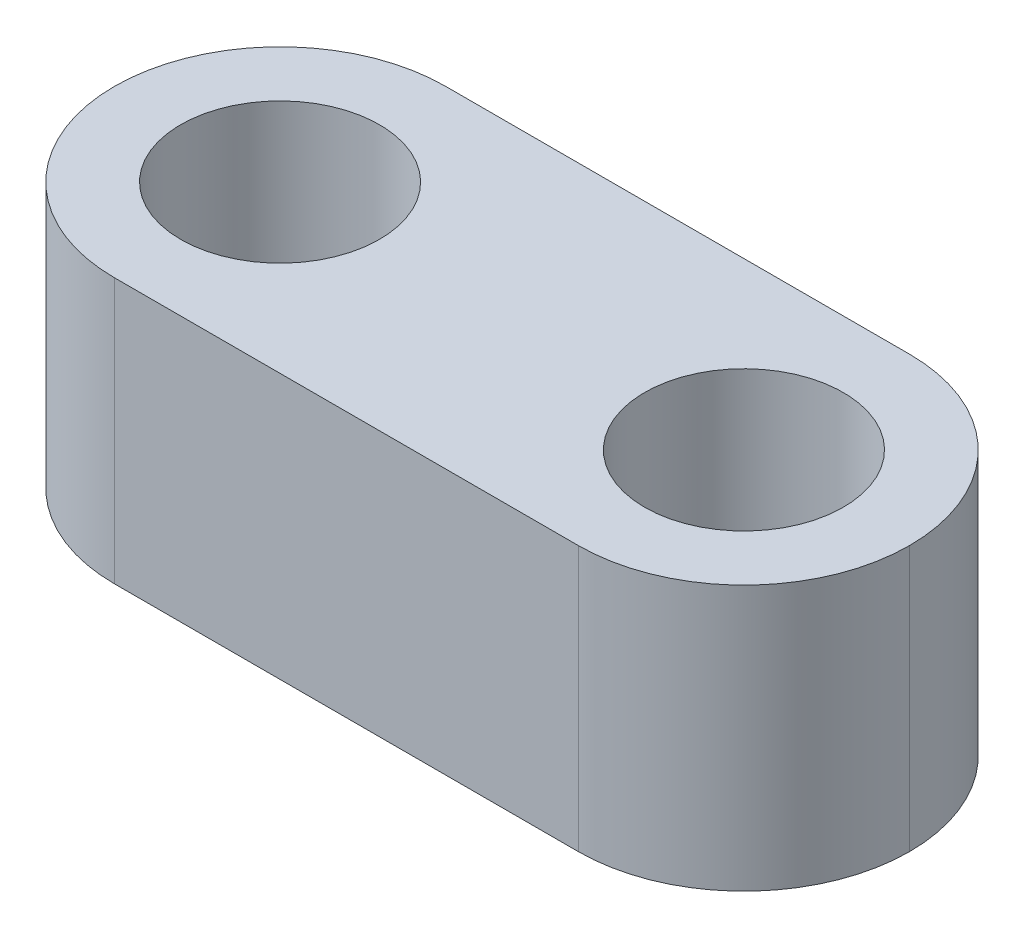
ISO-10303-21;
HEADER;
FILE_DESCRIPTION(('STEP AP214'),'2;1');
FILE_NAME('part.step','',(''),(''),'','','');
FILE_SCHEMA(('AUTOMOTIVE_DESIGN { 1 0 10303 214 1 1 1 1 }'));
ENDSEC;
DATA;
#1=APPLICATION_CONTEXT('core data for automotive mechanical design processes');
#2=APPLICATION_PROTOCOL_DEFINITION('international standard','automotive_design',2000,#1);
#3=PRODUCT_CONTEXT('',#1,'mechanical');
#4=PRODUCT('Part','Part','',(#3));
#5=PRODUCT_RELATED_PRODUCT_CATEGORY('part','',(#4));
#6=PRODUCT_DEFINITION_FORMATION('','',#4);
#7=PRODUCT_DEFINITION_CONTEXT('part definition',#1,'design');
#8=PRODUCT_DEFINITION('design','',#6,#7);
#9=PRODUCT_DEFINITION_SHAPE('','',#8);
#10=(LENGTH_UNIT() NAMED_UNIT(*) SI_UNIT(.MILLI.,.METRE.));
#11=(NAMED_UNIT(*) PLANE_ANGLE_UNIT() SI_UNIT($,.RADIAN.));
#12=(NAMED_UNIT(*) SI_UNIT($,.STERADIAN.) SOLID_ANGLE_UNIT());
#13=UNCERTAINTY_MEASURE_WITH_UNIT(LENGTH_MEASURE(1.E-05),#10,'distance_accuracy_value','');
#14=(GEOMETRIC_REPRESENTATION_CONTEXT(3) GLOBAL_UNCERTAINTY_ASSIGNED_CONTEXT((#13)) GLOBAL_UNIT_ASSIGNED_CONTEXT((#10,
#11,#12)) REPRESENTATION_CONTEXT('',''));
#15=CARTESIAN_POINT('',(0.,0.,0.));
#16=DIRECTION('',(0.,0.,1.));
#17=DIRECTION('',(1.,0.,0.));
#18=AXIS2_PLACEMENT_3D('',#15,#16,#17);
#19=CARTESIAN_POINT('',(-6.,4.,-2.5));
#20=DIRECTION('',(0.,0.,1.));
#21=DIRECTION('',(1.,0.,0.));
#22=AXIS2_PLACEMENT_3D('',#19,#20,#21);
#23=PLANE('',#22);
#24=DIRECTION('',(-1.,0.,0.));
#25=VECTOR('',#24,1.);
#26=CARTESIAN_POINT('',(-6.,4.,-2.5));
#27=LINE('',#26,#25);
#28=CARTESIAN_POINT('',(3.5,4.,-2.5));
#29=VERTEX_POINT('',#28);
#30=CARTESIAN_POINT('',(-3.5,4.,-2.5));
#31=VERTEX_POINT('',#30);
#32=EDGE_CURVE('E132',#29,#31,#27,.T.);
#33=ORIENTED_EDGE('',*,*,#32,.F.);
#34=DIRECTION('',(0.,-1.,0.));
#35=VECTOR('',#34,1.);
#36=CARTESIAN_POINT('',(3.5,4.,-2.5));
#37=LINE('',#36,#35);
#38=CARTESIAN_POINT('',(3.5,0.,-2.5));
#39=VERTEX_POINT('',#38);
#40=EDGE_CURVE('E11',#29,#39,#37,.T.);
#41=ORIENTED_EDGE('',*,*,#40,.T.);
#42=DIRECTION('',(-1.,0.,0.));
#43=VECTOR('',#42,1.);
#44=CARTESIAN_POINT('',(-6.,0.,-2.5));
#45=LINE('',#44,#43);
#46=CARTESIAN_POINT('',(-3.5,0.,-2.5));
#47=VERTEX_POINT('',#46);
#48=EDGE_CURVE('E95',#39,#47,#45,.T.);
#49=ORIENTED_EDGE('',*,*,#48,.T.);
#50=DIRECTION('',(0.,-1.,0.));
#51=VECTOR('',#50,1.);
#52=CARTESIAN_POINT('',(-3.5,4.,-2.5));
#53=LINE('',#52,#51);
#54=EDGE_CURVE('E42',#47,#31,#53,.F.);
#55=ORIENTED_EDGE('',*,*,#54,.T.);
#56=EDGE_LOOP('',(#33,#41,#49,#55));
#57=FACE_BOUND('',#56,.T.);
#58=ADVANCED_FACE('F33',(#57),#23,.F.);
#59=CARTESIAN_POINT('',(-6.,4.,2.5));
#60=DIRECTION('',(0.,0.,-1.));
#61=DIRECTION('',(-1.,0.,0.));
#62=AXIS2_PLACEMENT_3D('',#59,#60,#61);
#63=PLANE('',#62);
#64=DIRECTION('',(1.,0.,0.));
#65=VECTOR('',#64,1.);
#66=CARTESIAN_POINT('',(-6.,0.,2.5));
#67=LINE('',#66,#65);
#68=CARTESIAN_POINT('',(-3.5,0.,2.5));
#69=VERTEX_POINT('',#68);
#70=CARTESIAN_POINT('',(3.5,0.,2.5));
#71=VERTEX_POINT('',#70);
#72=EDGE_CURVE('E131',#69,#71,#67,.T.);
#73=ORIENTED_EDGE('',*,*,#72,.T.);
#74=DIRECTION('',(0.,-1.,0.));
#75=VECTOR('',#74,1.);
#76=CARTESIAN_POINT('',(3.5,4.,2.5));
#77=LINE('',#76,#75);
#78=CARTESIAN_POINT('',(3.5,4.,2.5));
#79=VERTEX_POINT('',#78);
#80=EDGE_CURVE('E110',#71,#79,#77,.F.);
#81=ORIENTED_EDGE('',*,*,#80,.T.);
#82=DIRECTION('',(1.,0.,0.));
#83=VECTOR('',#82,1.);
#84=CARTESIAN_POINT('',(-6.,4.,2.5));
#85=LINE('',#84,#83);
#86=CARTESIAN_POINT('',(-3.5,4.,2.5));
#87=VERTEX_POINT('',#86);
#88=EDGE_CURVE('E127',#87,#79,#85,.T.);
#89=ORIENTED_EDGE('',*,*,#88,.F.);
#90=DIRECTION('',(0.,-1.,0.));
#91=VECTOR('',#90,1.);
#92=CARTESIAN_POINT('',(-3.5,4.,2.5));
#93=LINE('',#92,#91);
#94=EDGE_CURVE('E111',#87,#69,#93,.T.);
#95=ORIENTED_EDGE('',*,*,#94,.T.);
#96=EDGE_LOOP('',(#73,#81,#89,#95));
#97=FACE_BOUND('',#96,.T.);
#98=ADVANCED_FACE('F129',(#97),#63,.F.);
#99=CARTESIAN_POINT('',(0.,4.,0.));
#100=DIRECTION('',(0.,1.,0.));
#101=DIRECTION('',(0.,0.,1.));
#102=AXIS2_PLACEMENT_3D('',#99,#100,#101);
#103=PLANE('',#102);
#104=CARTESIAN_POINT('',(-3.5,4.,0.));
#105=DIRECTION('',(0.,1.,0.));
#106=DIRECTION('',(0.,0.,1.));
#107=AXIS2_PLACEMENT_3D('',#104,#105,#106);
#108=CIRCLE('',#107,1.5);
#109=CARTESIAN_POINT('',(-3.5,4.,1.5));
#110=VERTEX_POINT('',#109);
#111=EDGE_CURVE('E106',#110,#110,#108,.T.);
#112=ORIENTED_EDGE('',*,*,#111,.F.);
#113=EDGE_LOOP('',(#112));
#114=FACE_BOUND('',#113,.T.);
#115=CARTESIAN_POINT('',(3.5,4.,0.));
#116=DIRECTION('',(0.,1.,0.));
#117=DIRECTION('',(0.,0.,1.));
#118=AXIS2_PLACEMENT_3D('',#115,#116,#117);
#119=CIRCLE('',#118,1.5);
#120=CARTESIAN_POINT('',(3.5,4.,1.5));
#121=VERTEX_POINT('',#120);
#122=EDGE_CURVE('E187',#121,#121,#119,.T.);
#123=ORIENTED_EDGE('',*,*,#122,.F.);
#124=EDGE_LOOP('',(#123));
#125=FACE_BOUND('',#124,.T.);
#126=ORIENTED_EDGE('',*,*,#88,.T.);
#127=CARTESIAN_POINT('',(3.5,4.,0.));
#128=DIRECTION('',(0.,1.,0.));
#129=DIRECTION('',(0.,0.,1.));
#130=AXIS2_PLACEMENT_3D('',#127,#128,#129);
#131=CIRCLE('',#130,2.5);
#132=CARTESIAN_POINT('',(6.,4.,0.));
#133=VERTEX_POINT('',#132);
#134=EDGE_CURVE('E122',#79,#133,#131,.T.);
#135=ORIENTED_EDGE('',*,*,#134,.T.);
#136=CARTESIAN_POINT('',(3.5,4.,0.));
#137=DIRECTION('',(0.,1.,0.));
#138=DIRECTION('',(0.,0.,1.));
#139=AXIS2_PLACEMENT_3D('',#136,#137,#138);
#140=CIRCLE('',#139,2.5);
#141=EDGE_CURVE('E104',#133,#29,#140,.T.);
#142=ORIENTED_EDGE('',*,*,#141,.T.);
#143=ORIENTED_EDGE('',*,*,#32,.T.);
#144=CARTESIAN_POINT('',(-3.5,4.,0.));
#145=DIRECTION('',(0.,1.,0.));
#146=DIRECTION('',(0.,0.,1.));
#147=AXIS2_PLACEMENT_3D('',#144,#145,#146);
#148=CIRCLE('',#147,2.5);
#149=CARTESIAN_POINT('',(-6.,4.,0.));
#150=VERTEX_POINT('',#149);
#151=EDGE_CURVE('E50',#31,#150,#148,.T.);
#152=ORIENTED_EDGE('',*,*,#151,.T.);
#153=CARTESIAN_POINT('',(-3.5,4.,0.));
#154=DIRECTION('',(0.,1.,0.));
#155=DIRECTION('',(0.,0.,1.));
#156=AXIS2_PLACEMENT_3D('',#153,#154,#155);
#157=CIRCLE('',#156,2.5);
#158=EDGE_CURVE('E119',#150,#87,#157,.T.);
#159=ORIENTED_EDGE('',*,*,#158,.T.);
#160=EDGE_LOOP('',(#126,#135,#142,#143,#152,#159));
#161=FACE_BOUND('',#160,.T.);
#162=ADVANCED_FACE('F125',(#114,#125,#161),#103,.T.);
#163=CARTESIAN_POINT('',(0.,0.,0.));
#164=DIRECTION('',(0.,1.,0.));
#165=DIRECTION('',(0.,0.,1.));
#166=AXIS2_PLACEMENT_3D('',#163,#164,#165);
#167=PLANE('',#166);
#168=CARTESIAN_POINT('',(-3.5,0.,0.));
#169=DIRECTION('',(0.,1.,0.));
#170=DIRECTION('',(0.,0.,1.));
#171=AXIS2_PLACEMENT_3D('',#168,#169,#170);
#172=CIRCLE('',#171,1.5);
#173=CARTESIAN_POINT('',(-3.5,0.,1.5));
#174=VERTEX_POINT('',#173);
#175=EDGE_CURVE('E184',#174,#174,#172,.T.);
#176=ORIENTED_EDGE('',*,*,#175,.T.);
#177=EDGE_LOOP('',(#176));
#178=FACE_BOUND('',#177,.T.);
#179=CARTESIAN_POINT('',(3.5,0.,0.));
#180=DIRECTION('',(0.,1.,0.));
#181=DIRECTION('',(0.,0.,1.));
#182=AXIS2_PLACEMENT_3D('',#179,#180,#181);
#183=CIRCLE('',#182,1.5);
#184=CARTESIAN_POINT('',(3.5,0.,1.5));
#185=VERTEX_POINT('',#184);
#186=EDGE_CURVE('E135',#185,#185,#183,.T.);
#187=ORIENTED_EDGE('',*,*,#186,.T.);
#188=EDGE_LOOP('',(#187));
#189=FACE_BOUND('',#188,.T.);
#190=CARTESIAN_POINT('',(3.5,0.,0.));
#191=DIRECTION('',(0.,1.,0.));
#192=DIRECTION('',(0.,0.,1.));
#193=AXIS2_PLACEMENT_3D('',#190,#191,#192);
#194=CIRCLE('',#193,2.5);
#195=CARTESIAN_POINT('',(6.,0.,0.));
#196=VERTEX_POINT('',#195);
#197=EDGE_CURVE('E88',#39,#196,#194,.F.);
#198=ORIENTED_EDGE('',*,*,#197,.T.);
#199=CARTESIAN_POINT('',(3.5,0.,0.));
#200=DIRECTION('',(0.,1.,0.));
#201=DIRECTION('',(0.,0.,1.));
#202=AXIS2_PLACEMENT_3D('',#199,#200,#201);
#203=CIRCLE('',#202,2.5);
#204=EDGE_CURVE('E93',#196,#71,#203,.F.);
#205=ORIENTED_EDGE('',*,*,#204,.T.);
#206=ORIENTED_EDGE('',*,*,#72,.F.);
#207=CARTESIAN_POINT('',(-3.5,0.,0.));
#208=DIRECTION('',(0.,1.,0.));
#209=DIRECTION('',(0.,0.,1.));
#210=AXIS2_PLACEMENT_3D('',#207,#208,#209);
#211=CIRCLE('',#210,2.5);
#212=CARTESIAN_POINT('',(-6.,0.,0.));
#213=VERTEX_POINT('',#212);
#214=EDGE_CURVE('E98',#69,#213,#211,.F.);
#215=ORIENTED_EDGE('',*,*,#214,.T.);
#216=CARTESIAN_POINT('',(-3.5,0.,0.));
#217=DIRECTION('',(0.,1.,0.));
#218=DIRECTION('',(0.,0.,1.));
#219=AXIS2_PLACEMENT_3D('',#216,#217,#218);
#220=CIRCLE('',#219,2.5);
#221=EDGE_CURVE('E139',#213,#47,#220,.F.);
#222=ORIENTED_EDGE('',*,*,#221,.T.);
#223=ORIENTED_EDGE('',*,*,#48,.F.);
#224=EDGE_LOOP('',(#198,#205,#206,#215,#222,#223));
#225=FACE_BOUND('',#224,.T.);
#226=ADVANCED_FACE('F90',(#178,#189,#225),#167,.F.);
#227=CARTESIAN_POINT('',(3.5,0.,0.));
#228=DIRECTION('',(0.,1.,0.));
#229=DIRECTION('',(0.,0.,1.));
#230=AXIS2_PLACEMENT_3D('',#227,#228,#229);
#231=CYLINDRICAL_SURFACE('',#230,1.5);
#232=ORIENTED_EDGE('',*,*,#186,.F.);
#233=EDGE_LOOP('',(#232));
#234=FACE_BOUND('',#233,.T.);
#235=ORIENTED_EDGE('',*,*,#122,.T.);
#236=EDGE_LOOP('',(#235));
#237=FACE_BOUND('',#236,.T.);
#238=ADVANCED_FACE('F165',(#234,#237),#231,.F.);
#239=CARTESIAN_POINT('',(-3.5,0.,0.));
#240=DIRECTION('',(0.,1.,0.));
#241=DIRECTION('',(0.,0.,1.));
#242=AXIS2_PLACEMENT_3D('',#239,#240,#241);
#243=CYLINDRICAL_SURFACE('',#242,1.5);
#244=ORIENTED_EDGE('',*,*,#175,.F.);
#245=EDGE_LOOP('',(#244));
#246=FACE_BOUND('',#245,.T.);
#247=ORIENTED_EDGE('',*,*,#111,.T.);
#248=EDGE_LOOP('',(#247));
#249=FACE_BOUND('',#248,.T.);
#250=ADVANCED_FACE('F161',(#246,#249),#243,.F.);
#251=CARTESIAN_POINT('',(3.5,4.,0.));
#252=DIRECTION('',(0.,-1.,0.));
#253=DIRECTION('',(0.,0.,-1.));
#254=AXIS2_PLACEMENT_3D('',#251,#252,#253);
#255=CYLINDRICAL_SURFACE('',#254,2.5);
#256=ORIENTED_EDGE('',*,*,#40,.F.);
#257=ORIENTED_EDGE('',*,*,#141,.F.);
#258=DIRECTION('',(0.,-1.,0.));
#259=VECTOR('',#258,1.);
#260=CARTESIAN_POINT('',(6.,4.,0.));
#261=LINE('',#260,#259);
#262=EDGE_CURVE('E102',#196,#133,#261,.F.);
#263=ORIENTED_EDGE('',*,*,#262,.F.);
#264=ORIENTED_EDGE('',*,*,#197,.F.);
#265=EDGE_LOOP('',(#256,#257,#263,#264));
#266=FACE_BOUND('',#265,.T.);
#267=ADVANCED_FACE('F103',(#266),#255,.T.);
#268=CARTESIAN_POINT('',(3.5,4.,0.));
#269=DIRECTION('',(0.,-1.,0.));
#270=DIRECTION('',(0.,0.,-1.));
#271=AXIS2_PLACEMENT_3D('',#268,#269,#270);
#272=CYLINDRICAL_SURFACE('',#271,2.5);
#273=ORIENTED_EDGE('',*,*,#134,.F.);
#274=ORIENTED_EDGE('',*,*,#80,.F.);
#275=ORIENTED_EDGE('',*,*,#204,.F.);
#276=ORIENTED_EDGE('',*,*,#262,.T.);
#277=EDGE_LOOP('',(#273,#274,#275,#276));
#278=FACE_BOUND('',#277,.T.);
#279=ADVANCED_FACE('F108',(#278),#272,.T.);
#280=CARTESIAN_POINT('',(-3.5,4.,0.));
#281=DIRECTION('',(0.,-1.,0.));
#282=DIRECTION('',(0.,0.,-1.));
#283=AXIS2_PLACEMENT_3D('',#280,#281,#282);
#284=CYLINDRICAL_SURFACE('',#283,2.5);
#285=DIRECTION('',(0.,-1.,0.));
#286=VECTOR('',#285,1.);
#287=CARTESIAN_POINT('',(-6.,4.,0.));
#288=LINE('',#287,#286);
#289=EDGE_CURVE('E37',#150,#213,#288,.T.);
#290=ORIENTED_EDGE('',*,*,#289,.F.);
#291=ORIENTED_EDGE('',*,*,#151,.F.);
#292=ORIENTED_EDGE('',*,*,#54,.F.);
#293=ORIENTED_EDGE('',*,*,#221,.F.);
#294=EDGE_LOOP('',(#290,#291,#292,#293));
#295=FACE_BOUND('',#294,.T.);
#296=ADVANCED_FACE('F35',(#295),#284,.T.);
#297=CARTESIAN_POINT('',(-3.5,4.,0.));
#298=DIRECTION('',(0.,-1.,0.));
#299=DIRECTION('',(0.,0.,-1.));
#300=AXIS2_PLACEMENT_3D('',#297,#298,#299);
#301=CYLINDRICAL_SURFACE('',#300,2.5);
#302=ORIENTED_EDGE('',*,*,#158,.F.);
#303=ORIENTED_EDGE('',*,*,#289,.T.);
#304=ORIENTED_EDGE('',*,*,#214,.F.);
#305=ORIENTED_EDGE('',*,*,#94,.F.);
#306=EDGE_LOOP('',(#302,#303,#304,#305));
#307=FACE_BOUND('',#306,.T.);
#308=ADVANCED_FACE('F145',(#307),#301,.T.);
#309=CLOSED_SHELL('',(#58,#98,#162,#226,#238,#250,#267,#279,#296,#308));
#310=MANIFOLD_SOLID_BREP('B2',#309);
#311=ADVANCED_BREP_SHAPE_REPRESENTATION('',(#18,#310),#14);
#312=SHAPE_DEFINITION_REPRESENTATION(#9,#311);
ENDSEC;
END-ISO-10303-21;
